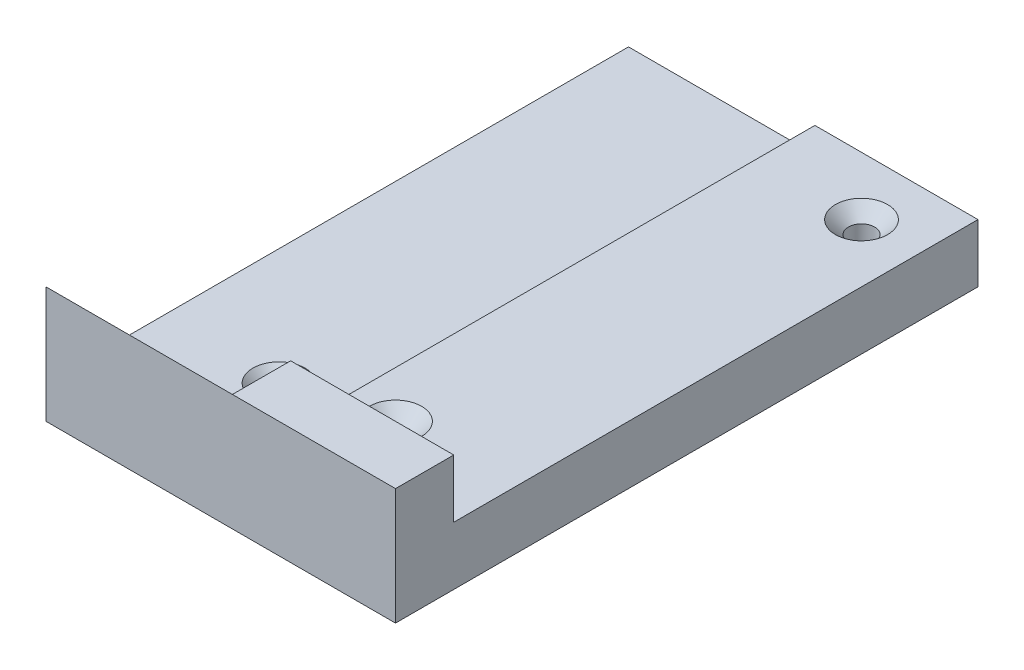
ISO-10303-21;
HEADER;
FILE_DESCRIPTION(('STEP AP214'),'2;1');
FILE_NAME('part.step','',(''),(''),'','','');
FILE_SCHEMA(('AUTOMOTIVE_DESIGN { 1 0 10303 214 1 1 1 1 }'));
ENDSEC;
DATA;
#1=APPLICATION_CONTEXT('core data for automotive mechanical design processes');
#2=APPLICATION_PROTOCOL_DEFINITION('international standard','automotive_design',2000,#1);
#3=PRODUCT_CONTEXT('',#1,'mechanical');
#4=PRODUCT('Part','Part','',(#3));
#5=PRODUCT_RELATED_PRODUCT_CATEGORY('part','',(#4));
#6=PRODUCT_DEFINITION_FORMATION('','',#4);
#7=PRODUCT_DEFINITION_CONTEXT('part definition',#1,'design');
#8=PRODUCT_DEFINITION('design','',#6,#7);
#9=PRODUCT_DEFINITION_SHAPE('','',#8);
#10=(LENGTH_UNIT() NAMED_UNIT(*) SI_UNIT(.MILLI.,.METRE.));
#11=(NAMED_UNIT(*) PLANE_ANGLE_UNIT() SI_UNIT($,.RADIAN.));
#12=(NAMED_UNIT(*) SI_UNIT($,.STERADIAN.) SOLID_ANGLE_UNIT());
#13=UNCERTAINTY_MEASURE_WITH_UNIT(LENGTH_MEASURE(1.E-05),#10,'distance_accuracy_value','');
#14=(GEOMETRIC_REPRESENTATION_CONTEXT(3) GLOBAL_UNCERTAINTY_ASSIGNED_CONTEXT((#13)) GLOBAL_UNIT_ASSIGNED_CONTEXT((#10,
#11,#12)) REPRESENTATION_CONTEXT('',''));
#15=CARTESIAN_POINT('',(0.,0.,0.));
#16=DIRECTION('',(0.,0.,1.));
#17=DIRECTION('',(1.,0.,0.));
#18=AXIS2_PLACEMENT_3D('',#15,#16,#17);
#19=CARTESIAN_POINT('',(-30.,20.,-50.));
#20=DIRECTION('',(1.,0.,0.));
#21=DIRECTION('',(0.,0.,1.));
#22=AXIS2_PLACEMENT_3D('',#19,#20,#21);
#23=PLANE('',#22);
#24=DIRECTION('',(0.,-0.784485752916001,-0.620146840249804));
#25=VECTOR('',#24,1.);
#26=CARTESIAN_POINT('',(-30.,13.675,45.));
#27=LINE('',#26,#25);
#28=CARTESIAN_POINT('',(-30.,20.,50.));
#29=VERTEX_POINT('',#28);
#30=CARTESIAN_POINT('',(-30.,13.675,45.));
#31=VERTEX_POINT('',#30);
#32=EDGE_CURVE('E114',#29,#31,#27,.T.);
#33=ORIENTED_EDGE('',*,*,#32,.T.);
#34=DIRECTION('',(0.,1.,0.));
#35=VECTOR('',#34,1.);
#36=CARTESIAN_POINT('',(-30.,5.675,45.));
#37=LINE('',#36,#35);
#38=CARTESIAN_POINT('',(-30.,5.675,45.));
#39=VERTEX_POINT('',#38);
#40=EDGE_CURVE('E123',#39,#31,#37,.T.);
#41=ORIENTED_EDGE('',*,*,#40,.F.);
#42=DIRECTION('',(0.,0.,-1.));
#43=VECTOR('',#42,1.);
#44=CARTESIAN_POINT('',(-30.,5.675,-50.));
#45=LINE('',#44,#43);
#46=CARTESIAN_POINT('',(-30.,5.675,-50.));
#47=VERTEX_POINT('',#46);
#48=EDGE_CURVE('E152',#39,#47,#45,.T.);
#49=ORIENTED_EDGE('',*,*,#48,.T.);
#50=DIRECTION('',(0.,-1.,0.));
#51=VECTOR('',#50,1.);
#52=CARTESIAN_POINT('',(-30.,20.,-50.));
#53=LINE('',#52,#51);
#54=CARTESIAN_POINT('',(-30.,0.,-50.));
#55=VERTEX_POINT('',#54);
#56=EDGE_CURVE('E184',#47,#55,#53,.T.);
#57=ORIENTED_EDGE('',*,*,#56,.T.);
#58=DIRECTION('',(0.,0.,-1.));
#59=VECTOR('',#58,1.);
#60=CARTESIAN_POINT('',(-30.,0.,-50.));
#61=LINE('',#60,#59);
#62=CARTESIAN_POINT('',(-30.,0.,50.));
#63=VERTEX_POINT('',#62);
#64=EDGE_CURVE('E177',#63,#55,#61,.T.);
#65=ORIENTED_EDGE('',*,*,#64,.F.);
#66=DIRECTION('',(0.,-1.,0.));
#67=VECTOR('',#66,1.);
#68=CARTESIAN_POINT('',(-30.,20.,50.));
#69=LINE('',#68,#67);
#70=EDGE_CURVE('E45',#29,#63,#69,.T.);
#71=ORIENTED_EDGE('',*,*,#70,.F.);
#72=EDGE_LOOP('',(#33,#41,#49,#57,#65,#71));
#73=FACE_BOUND('',#72,.T.);
#74=ADVANCED_FACE('F37',(#73),#23,.F.);
#75=CARTESIAN_POINT('',(-30.,5.675,45.));
#76=DIRECTION('',(0.,0.,1.));
#77=DIRECTION('',(-1.,0.,0.));
#78=AXIS2_PLACEMENT_3D('',#75,#76,#77);
#79=PLANE('',#78);
#80=DIRECTION('',(1.,0.,0.));
#81=VECTOR('',#80,1.);
#82=CARTESIAN_POINT('',(-217.90199457749,13.675,45.));
#83=LINE('',#82,#81);
#84=CARTESIAN_POINT('',(2.,13.675,45.));
#85=VERTEX_POINT('',#84);
#86=EDGE_CURVE('E52',#31,#85,#83,.T.);
#87=ORIENTED_EDGE('',*,*,#86,.T.);
#88=DIRECTION('',(0.,1.,0.));
#89=VECTOR('',#88,1.);
#90=CARTESIAN_POINT('',(2.00000000000002,5.675,45.));
#91=LINE('',#90,#89);
#92=CARTESIAN_POINT('',(2.00000000000002,5.675,45.));
#93=VERTEX_POINT('',#92);
#94=EDGE_CURVE('E117',#93,#85,#91,.T.);
#95=ORIENTED_EDGE('',*,*,#94,.F.);
#96=DIRECTION('',(-1.,0.,0.));
#97=VECTOR('',#96,1.);
#98=CARTESIAN_POINT('',(-30.,5.675,45.));
#99=LINE('',#98,#97);
#100=EDGE_CURVE('E159',#93,#39,#99,.T.);
#101=ORIENTED_EDGE('',*,*,#100,.T.);
#102=ORIENTED_EDGE('',*,*,#40,.T.);
#103=EDGE_LOOP('',(#87,#95,#101,#102));
#104=FACE_BOUND('',#103,.T.);
#105=ADVANCED_FACE('F126',(#104),#79,.F.);
#106=CARTESIAN_POINT('',(-30.,20.,-50.));
#107=DIRECTION('',(0.,0.,1.));
#108=DIRECTION('',(-1.,0.,0.));
#109=AXIS2_PLACEMENT_3D('',#106,#107,#108);
#110=PLANE('',#109);
#111=DIRECTION('',(1.,0.,0.));
#112=VECTOR('',#111,1.);
#113=CARTESIAN_POINT('',(2.00000000000003,10.,-50.));
#114=LINE('',#113,#112);
#115=CARTESIAN_POINT('',(2.00000000000003,10.,-50.));
#116=VERTEX_POINT('',#115);
#117=CARTESIAN_POINT('',(30.,10.,-50.));
#118=VERTEX_POINT('',#117);
#119=EDGE_CURVE('E138',#116,#118,#114,.T.);
#120=ORIENTED_EDGE('',*,*,#119,.T.);
#121=DIRECTION('',(0.,-1.,0.));
#122=VECTOR('',#121,1.);
#123=CARTESIAN_POINT('',(30.,20.,-50.));
#124=LINE('',#123,#122);
#125=CARTESIAN_POINT('',(30.,0.,-50.));
#126=VERTEX_POINT('',#125);
#127=EDGE_CURVE('E172',#118,#126,#124,.T.);
#128=ORIENTED_EDGE('',*,*,#127,.T.);
#129=DIRECTION('',(1.,0.,0.));
#130=VECTOR('',#129,1.);
#131=CARTESIAN_POINT('',(-30.,0.,-50.));
#132=LINE('',#131,#130);
#133=EDGE_CURVE('E170',#55,#126,#132,.T.);
#134=ORIENTED_EDGE('',*,*,#133,.F.);
#135=ORIENTED_EDGE('',*,*,#56,.F.);
#136=DIRECTION('',(1.,0.,0.));
#137=VECTOR('',#136,1.);
#138=CARTESIAN_POINT('',(-30.,5.675,-50.));
#139=LINE('',#138,#137);
#140=CARTESIAN_POINT('',(2.00000000000002,5.675,-50.));
#141=VERTEX_POINT('',#140);
#142=EDGE_CURVE('E155',#47,#141,#139,.T.);
#143=ORIENTED_EDGE('',*,*,#142,.T.);
#144=DIRECTION('',(0.,1.,0.));
#145=VECTOR('',#144,1.);
#146=CARTESIAN_POINT('',(2.00000000000002,5.675,-50.));
#147=LINE('',#146,#145);
#148=EDGE_CURVE('E124',#141,#116,#147,.T.);
#149=ORIENTED_EDGE('',*,*,#148,.T.);
#150=EDGE_LOOP('',(#120,#128,#134,#135,#143,#149));
#151=FACE_BOUND('',#150,.T.);
#152=ADVANCED_FACE('F209',(#151),#110,.F.);
#153=CARTESIAN_POINT('',(30.,20.,-50.));
#154=DIRECTION('',(-1.,0.,0.));
#155=DIRECTION('',(0.,0.,-1.));
#156=AXIS2_PLACEMENT_3D('',#153,#154,#155);
#157=PLANE('',#156);
#158=DIRECTION('',(0.,0.,1.));
#159=VECTOR('',#158,1.);
#160=CARTESIAN_POINT('',(30.,20.,-50.));
#161=LINE('',#160,#159);
#162=CARTESIAN_POINT('',(30.,20.,40.));
#163=VERTEX_POINT('',#162);
#164=CARTESIAN_POINT('',(30.,20.,50.));
#165=VERTEX_POINT('',#164);
#166=EDGE_CURVE('E166',#163,#165,#161,.T.);
#167=ORIENTED_EDGE('',*,*,#166,.T.);
#168=DIRECTION('',(0.,-1.,0.));
#169=VECTOR('',#168,1.);
#170=CARTESIAN_POINT('',(30.,20.,50.));
#171=LINE('',#170,#169);
#172=CARTESIAN_POINT('',(30.,0.,50.));
#173=VERTEX_POINT('',#172);
#174=EDGE_CURVE('E11',#165,#173,#171,.T.);
#175=ORIENTED_EDGE('',*,*,#174,.T.);
#176=DIRECTION('',(0.,0.,1.));
#177=VECTOR('',#176,1.);
#178=CARTESIAN_POINT('',(30.,0.,-50.));
#179=LINE('',#178,#177);
#180=EDGE_CURVE('E162',#126,#173,#179,.T.);
#181=ORIENTED_EDGE('',*,*,#180,.F.);
#182=ORIENTED_EDGE('',*,*,#127,.F.);
#183=DIRECTION('',(0.,0.,1.));
#184=VECTOR('',#183,1.);
#185=CARTESIAN_POINT('',(30.,10.,40.));
#186=LINE('',#185,#184);
#187=CARTESIAN_POINT('',(30.,10.,40.));
#188=VERTEX_POINT('',#187);
#189=EDGE_CURVE('E141',#118,#188,#186,.T.);
#190=ORIENTED_EDGE('',*,*,#189,.T.);
#191=DIRECTION('',(0.,1.,0.));
#192=VECTOR('',#191,1.);
#193=CARTESIAN_POINT('',(30.,10.,40.));
#194=LINE('',#193,#192);
#195=EDGE_CURVE('E145',#188,#163,#194,.T.);
#196=ORIENTED_EDGE('',*,*,#195,.T.);
#197=EDGE_LOOP('',(#167,#175,#181,#182,#190,#196));
#198=FACE_BOUND('',#197,.T.);
#199=ADVANCED_FACE('F39',(#198),#157,.F.);
#200=CARTESIAN_POINT('',(-30.,20.,50.));
#201=DIRECTION('',(0.,0.,-1.));
#202=DIRECTION('',(1.,0.,0.));
#203=AXIS2_PLACEMENT_3D('',#200,#201,#202);
#204=PLANE('',#203);
#205=DIRECTION('',(-1.,0.,0.));
#206=VECTOR('',#205,1.);
#207=CARTESIAN_POINT('',(-30.,0.,50.));
#208=LINE('',#207,#206);
#209=EDGE_CURVE('E175',#173,#63,#208,.T.);
#210=ORIENTED_EDGE('',*,*,#209,.F.);
#211=ORIENTED_EDGE('',*,*,#174,.F.);
#212=DIRECTION('',(-1.,0.,0.));
#213=VECTOR('',#212,1.);
#214=CARTESIAN_POINT('',(-30.,20.,50.));
#215=LINE('',#214,#213);
#216=CARTESIAN_POINT('',(2.00000000000002,20.,50.));
#217=VERTEX_POINT('',#216);
#218=EDGE_CURVE('E169',#165,#217,#215,.T.);
#219=ORIENTED_EDGE('',*,*,#218,.T.);
#220=DIRECTION('',(1.,0.,0.));
#221=VECTOR('',#220,1.);
#222=CARTESIAN_POINT('',(-217.90199457749,20.,50.));
#223=LINE('',#222,#221);
#224=EDGE_CURVE('E112',#29,#217,#223,.T.);
#225=ORIENTED_EDGE('',*,*,#224,.F.);
#226=ORIENTED_EDGE('',*,*,#70,.T.);
#227=EDGE_LOOP('',(#210,#211,#219,#225,#226));
#228=FACE_BOUND('',#227,.T.);
#229=ADVANCED_FACE('F190',(#228),#204,.F.);
#230=CARTESIAN_POINT('',(0.,20.,0.));
#231=DIRECTION('',(0.,-1.,0.));
#232=DIRECTION('',(0.,0.,1.));
#233=AXIS2_PLACEMENT_3D('',#230,#231,#232);
#234=PLANE('',#233);
#235=ORIENTED_EDGE('',*,*,#218,.F.);
#236=ORIENTED_EDGE('',*,*,#166,.F.);
#237=DIRECTION('',(-1.,0.,0.));
#238=VECTOR('',#237,1.);
#239=CARTESIAN_POINT('',(2.00000000000002,20.,40.));
#240=LINE('',#239,#238);
#241=CARTESIAN_POINT('',(2.00000000000002,20.,40.));
#242=VERTEX_POINT('',#241);
#243=EDGE_CURVE('E129',#163,#242,#240,.T.);
#244=ORIENTED_EDGE('',*,*,#243,.T.);
#245=DIRECTION('',(0.,0.,1.));
#246=VECTOR('',#245,1.);
#247=CARTESIAN_POINT('',(2.00000000000002,20.,-50.));
#248=LINE('',#247,#246);
#249=EDGE_CURVE('E149',#242,#217,#248,.T.);
#250=ORIENTED_EDGE('',*,*,#249,.T.);
#251=EDGE_LOOP('',(#235,#236,#244,#250));
#252=FACE_BOUND('',#251,.T.);
#253=ADVANCED_FACE('F200',(#252),#234,.F.);
#254=CARTESIAN_POINT('',(0.,0.,0.));
#255=DIRECTION('',(0.,-1.,0.));
#256=DIRECTION('',(0.,0.,1.));
#257=AXIS2_PLACEMENT_3D('',#254,#255,#256);
#258=PLANE('',#257);
#259=CARTESIAN_POINT('',(10.,0.,30.));
#260=DIRECTION('',(0.,-1.,0.));
#261=DIRECTION('',(0.,0.,-1.));
#262=AXIS2_PLACEMENT_3D('',#259,#260,#261);
#263=CIRCLE('',#262,2.25);
#264=CARTESIAN_POINT('',(10.,0.,27.75));
#265=VERTEX_POINT('',#264);
#266=EDGE_CURVE('E226',#265,#265,#263,.T.);
#267=ORIENTED_EDGE('',*,*,#266,.F.);
#268=EDGE_LOOP('',(#267));
#269=FACE_BOUND('',#268,.T.);
#270=CARTESIAN_POINT('',(-9.99999999999998,0.,30.));
#271=DIRECTION('',(0.,-1.,0.));
#272=DIRECTION('',(0.,0.,-1.));
#273=AXIS2_PLACEMENT_3D('',#270,#271,#272);
#274=CIRCLE('',#273,2.25);
#275=CARTESIAN_POINT('',(-9.99999999999998,0.,27.75));
#276=VERTEX_POINT('',#275);
#277=EDGE_CURVE('E223',#276,#276,#274,.T.);
#278=ORIENTED_EDGE('',*,*,#277,.F.);
#279=EDGE_LOOP('',(#278));
#280=FACE_BOUND('',#279,.T.);
#281=CARTESIAN_POINT('',(20.,0.,-40.));
#282=DIRECTION('',(0.,-1.,0.));
#283=DIRECTION('',(0.,0.,-1.));
#284=AXIS2_PLACEMENT_3D('',#281,#282,#283);
#285=CIRCLE('',#284,2.25);
#286=CARTESIAN_POINT('',(20.,0.,-42.25));
#287=VERTEX_POINT('',#286);
#288=EDGE_CURVE('E213',#287,#287,#285,.T.);
#289=ORIENTED_EDGE('',*,*,#288,.F.);
#290=EDGE_LOOP('',(#289));
#291=FACE_BOUND('',#290,.T.);
#292=ORIENTED_EDGE('',*,*,#180,.T.);
#293=ORIENTED_EDGE('',*,*,#209,.T.);
#294=ORIENTED_EDGE('',*,*,#64,.T.);
#295=ORIENTED_EDGE('',*,*,#133,.T.);
#296=EDGE_LOOP('',(#292,#293,#294,#295));
#297=FACE_BOUND('',#296,.T.);
#298=ADVANCED_FACE('F195',(#269,#280,#291,#297),#258,.T.);
#299=CARTESIAN_POINT('',(2.00000000000002,5.675,-50.));
#300=DIRECTION('',(1.,0.,0.));
#301=DIRECTION('',(0.,0.,1.));
#302=AXIS2_PLACEMENT_3D('',#299,#300,#301);
#303=PLANE('',#302);
#304=DIRECTION('',(0.,0.,-1.));
#305=VECTOR('',#304,1.);
#306=CARTESIAN_POINT('',(2.00000000000002,10.,40.));
#307=LINE('',#306,#305);
#308=CARTESIAN_POINT('',(2.00000000000002,10.,40.));
#309=VERTEX_POINT('',#308);
#310=EDGE_CURVE('E132',#309,#116,#307,.T.);
#311=ORIENTED_EDGE('',*,*,#310,.T.);
#312=ORIENTED_EDGE('',*,*,#148,.F.);
#313=DIRECTION('',(0.,0.,1.));
#314=VECTOR('',#313,1.);
#315=CARTESIAN_POINT('',(2.00000000000002,5.675,-50.));
#316=LINE('',#315,#314);
#317=EDGE_CURVE('E120',#141,#93,#316,.T.);
#318=ORIENTED_EDGE('',*,*,#317,.T.);
#319=ORIENTED_EDGE('',*,*,#94,.T.);
#320=DIRECTION('',(0.,-0.784485752916001,-0.620146840249804));
#321=VECTOR('',#320,1.);
#322=CARTESIAN_POINT('',(2.00000000000003,13.675,45.));
#323=LINE('',#322,#321);
#324=EDGE_CURVE('E59',#217,#85,#323,.T.);
#325=ORIENTED_EDGE('',*,*,#324,.F.);
#326=ORIENTED_EDGE('',*,*,#249,.F.);
#327=DIRECTION('',(0.,1.,0.));
#328=VECTOR('',#327,1.);
#329=CARTESIAN_POINT('',(2.00000000000002,10.,40.));
#330=LINE('',#329,#328);
#331=EDGE_CURVE('E147',#309,#242,#330,.T.);
#332=ORIENTED_EDGE('',*,*,#331,.F.);
#333=EDGE_LOOP('',(#311,#312,#318,#319,#325,#326,#332));
#334=FACE_BOUND('',#333,.T.);
#335=ADVANCED_FACE('F118',(#334),#303,.F.);
#336=CARTESIAN_POINT('',(0.,5.675,0.));
#337=DIRECTION('',(0.,-1.,0.));
#338=DIRECTION('',(0.,0.,1.));
#339=AXIS2_PLACEMENT_3D('',#336,#337,#338);
#340=PLANE('',#339);
#341=CARTESIAN_POINT('',(-9.99999999999998,5.675,30.));
#342=DIRECTION('',(0.,-1.,0.));
#343=DIRECTION('',(0.,0.,-1.));
#344=AXIS2_PLACEMENT_3D('',#341,#342,#343);
#345=CIRCLE('',#344,4.48);
#346=CARTESIAN_POINT('',(-9.99999999999998,5.675,25.52));
#347=VERTEX_POINT('',#346);
#348=EDGE_CURVE('E238',#347,#347,#345,.T.);
#349=ORIENTED_EDGE('',*,*,#348,.T.);
#350=EDGE_LOOP('',(#349));
#351=FACE_BOUND('',#350,.T.);
#352=ORIENTED_EDGE('',*,*,#48,.F.);
#353=ORIENTED_EDGE('',*,*,#100,.F.);
#354=ORIENTED_EDGE('',*,*,#317,.F.);
#355=ORIENTED_EDGE('',*,*,#142,.F.);
#356=EDGE_LOOP('',(#352,#353,#354,#355));
#357=FACE_BOUND('',#356,.T.);
#358=ADVANCED_FACE('F212',(#351,#357),#340,.F.);
#359=CARTESIAN_POINT('',(2.00000000000002,10.,40.));
#360=DIRECTION('',(0.,0.,1.));
#361=DIRECTION('',(-1.,0.,0.));
#362=AXIS2_PLACEMENT_3D('',#359,#360,#361);
#363=PLANE('',#362);
#364=ORIENTED_EDGE('',*,*,#243,.F.);
#365=ORIENTED_EDGE('',*,*,#195,.F.);
#366=DIRECTION('',(-1.,0.,0.));
#367=VECTOR('',#366,1.);
#368=CARTESIAN_POINT('',(2.00000000000002,10.,40.));
#369=LINE('',#368,#367);
#370=EDGE_CURVE('E144',#188,#309,#369,.T.);
#371=ORIENTED_EDGE('',*,*,#370,.T.);
#372=ORIENTED_EDGE('',*,*,#331,.T.);
#373=EDGE_LOOP('',(#364,#365,#371,#372));
#374=FACE_BOUND('',#373,.T.);
#375=ADVANCED_FACE('F323',(#374),#363,.F.);
#376=CARTESIAN_POINT('',(0.,10.,0.));
#377=DIRECTION('',(0.,1.,0.));
#378=DIRECTION('',(0.,0.,-1.));
#379=AXIS2_PLACEMENT_3D('',#376,#377,#378);
#380=PLANE('',#379);
#381=CARTESIAN_POINT('',(10.,10.,30.));
#382=DIRECTION('',(0.,-1.,0.));
#383=DIRECTION('',(0.,0.,-1.));
#384=AXIS2_PLACEMENT_3D('',#381,#382,#383);
#385=CIRCLE('',#384,4.48);
#386=CARTESIAN_POINT('',(10.,10.,25.52));
#387=VERTEX_POINT('',#386);
#388=EDGE_CURVE('E232',#387,#387,#385,.T.);
#389=ORIENTED_EDGE('',*,*,#388,.T.);
#390=EDGE_LOOP('',(#389));
#391=FACE_BOUND('',#390,.T.);
#392=CARTESIAN_POINT('',(20.,10.,-40.));
#393=DIRECTION('',(0.,-1.,0.));
#394=DIRECTION('',(0.,0.,-1.));
#395=AXIS2_PLACEMENT_3D('',#392,#393,#394);
#396=CIRCLE('',#395,4.48);
#397=CARTESIAN_POINT('',(20.,10.,-44.48));
#398=VERTEX_POINT('',#397);
#399=EDGE_CURVE('E220',#398,#398,#396,.T.);
#400=ORIENTED_EDGE('',*,*,#399,.T.);
#401=EDGE_LOOP('',(#400));
#402=FACE_BOUND('',#401,.T.);
#403=ORIENTED_EDGE('',*,*,#310,.F.);
#404=ORIENTED_EDGE('',*,*,#370,.F.);
#405=ORIENTED_EDGE('',*,*,#189,.F.);
#406=ORIENTED_EDGE('',*,*,#119,.F.);
#407=EDGE_LOOP('',(#403,#404,#405,#406));
#408=FACE_BOUND('',#407,.T.);
#409=ADVANCED_FACE('F206',(#391,#402,#408),#380,.T.);
#410=CARTESIAN_POINT('',(-217.90199457749,13.675,45.));
#411=DIRECTION('',(0.,-0.620146840249803,0.784485752916001));
#412=DIRECTION('',(0.,0.784485752916001,0.620146840249804));
#413=AXIS2_PLACEMENT_3D('',#410,#411,#412);
#414=PLANE('',#413);
#415=ORIENTED_EDGE('',*,*,#32,.F.);
#416=ORIENTED_EDGE('',*,*,#224,.T.);
#417=ORIENTED_EDGE('',*,*,#324,.T.);
#418=ORIENTED_EDGE('',*,*,#86,.F.);
#419=EDGE_LOOP('',(#415,#416,#417,#418));
#420=FACE_BOUND('',#419,.T.);
#421=ADVANCED_FACE('F111',(#420),#414,.F.);
#422=CARTESIAN_POINT('',(20.,10.,-40.));
#423=DIRECTION('',(0.,1.,0.));
#424=DIRECTION('',(0.,0.,-1.));
#425=AXIS2_PLACEMENT_3D('',#422,#423,#424);
#426=CYLINDRICAL_SURFACE('',#425,2.25);
#427=ORIENTED_EDGE('',*,*,#288,.T.);
#428=EDGE_LOOP('',(#427));
#429=FACE_BOUND('',#428,.T.);
#430=CARTESIAN_POINT('',(20.,7.77,-40.));
#431=DIRECTION('',(0.,-1.,0.));
#432=DIRECTION('',(0.,0.,-1.));
#433=AXIS2_PLACEMENT_3D('',#430,#431,#432);
#434=CIRCLE('',#433,2.25);
#435=CARTESIAN_POINT('',(20.,7.77,-42.25));
#436=VERTEX_POINT('',#435);
#437=EDGE_CURVE('E215',#436,#436,#434,.T.);
#438=ORIENTED_EDGE('',*,*,#437,.F.);
#439=EDGE_LOOP('',(#438));
#440=FACE_BOUND('',#439,.T.);
#441=ADVANCED_FACE('F346',(#429,#440),#426,.F.);
#442=CARTESIAN_POINT('',(20.,10.,-40.));
#443=DIRECTION('',(0.,1.,0.));
#444=DIRECTION('',(0.,0.,-1.));
#445=AXIS2_PLACEMENT_3D('',#442,#443,#444);
#446=CONICAL_SURFACE('',#445,4.48,0.785398163397449);
#447=ORIENTED_EDGE('',*,*,#437,.T.);
#448=EDGE_LOOP('',(#447));
#449=FACE_BOUND('',#448,.T.);
#450=ORIENTED_EDGE('',*,*,#399,.F.);
#451=EDGE_LOOP('',(#450));
#452=FACE_BOUND('',#451,.T.);
#453=ADVANCED_FACE('F354',(#449,#452),#446,.F.);
#454=CARTESIAN_POINT('',(-9.99999999999998,10.,30.));
#455=DIRECTION('',(0.,1.,0.));
#456=DIRECTION('',(0.,0.,-1.));
#457=AXIS2_PLACEMENT_3D('',#454,#455,#456);
#458=CYLINDRICAL_SURFACE('',#457,2.25);
#459=CARTESIAN_POINT('',(-9.99999999999998,3.44499999999999,30.));
#460=DIRECTION('',(0.,-1.,0.));
#461=DIRECTION('',(0.,0.,-1.));
#462=AXIS2_PLACEMENT_3D('',#459,#460,#461);
#463=CIRCLE('',#462,2.24999999999999);
#464=CARTESIAN_POINT('',(-9.99999999999998,3.44499999999999,27.75));
#465=VERTEX_POINT('',#464);
#466=EDGE_CURVE('E235',#465,#465,#463,.T.);
#467=ORIENTED_EDGE('',*,*,#466,.F.);
#468=EDGE_LOOP('',(#467));
#469=FACE_BOUND('',#468,.T.);
#470=ORIENTED_EDGE('',*,*,#277,.T.);
#471=EDGE_LOOP('',(#470));
#472=FACE_BOUND('',#471,.T.);
#473=ADVANCED_FACE('F363',(#469,#472),#458,.F.);
#474=CARTESIAN_POINT('',(10.,10.,30.));
#475=DIRECTION('',(0.,1.,0.));
#476=DIRECTION('',(0.,0.,-1.));
#477=AXIS2_PLACEMENT_3D('',#474,#475,#476);
#478=CYLINDRICAL_SURFACE('',#477,2.25);
#479=ORIENTED_EDGE('',*,*,#266,.T.);
#480=EDGE_LOOP('',(#479));
#481=FACE_BOUND('',#480,.T.);
#482=CARTESIAN_POINT('',(10.,7.77,30.));
#483=DIRECTION('',(0.,-1.,0.));
#484=DIRECTION('',(0.,0.,-1.));
#485=AXIS2_PLACEMENT_3D('',#482,#483,#484);
#486=CIRCLE('',#485,2.25);
#487=CARTESIAN_POINT('',(10.,7.77,27.75));
#488=VERTEX_POINT('',#487);
#489=EDGE_CURVE('E229',#488,#488,#486,.T.);
#490=ORIENTED_EDGE('',*,*,#489,.F.);
#491=EDGE_LOOP('',(#490));
#492=FACE_BOUND('',#491,.T.);
#493=ADVANCED_FACE('F251',(#481,#492),#478,.F.);
#494=CARTESIAN_POINT('',(10.,10.,30.));
#495=DIRECTION('',(0.,1.,0.));
#496=DIRECTION('',(0.,0.,-1.));
#497=AXIS2_PLACEMENT_3D('',#494,#495,#496);
#498=CONICAL_SURFACE('',#497,4.48,0.785398163397448);
#499=ORIENTED_EDGE('',*,*,#489,.T.);
#500=EDGE_LOOP('',(#499));
#501=FACE_BOUND('',#500,.T.);
#502=ORIENTED_EDGE('',*,*,#388,.F.);
#503=EDGE_LOOP('',(#502));
#504=FACE_BOUND('',#503,.T.);
#505=ADVANCED_FACE('F245',(#501,#504),#498,.F.);
#506=CARTESIAN_POINT('',(-9.99999999999998,5.675,30.));
#507=DIRECTION('',(0.,1.,0.));
#508=DIRECTION('',(0.,0.,-1.));
#509=AXIS2_PLACEMENT_3D('',#506,#507,#508);
#510=CONICAL_SURFACE('',#509,4.48,0.785398163397449);
#511=ORIENTED_EDGE('',*,*,#466,.T.);
#512=EDGE_LOOP('',(#511));
#513=FACE_BOUND('',#512,.T.);
#514=ORIENTED_EDGE('',*,*,#348,.F.);
#515=EDGE_LOOP('',(#514));
#516=FACE_BOUND('',#515,.T.);
#517=ADVANCED_FACE('F243',(#513,#516),#510,.F.);
#518=CLOSED_SHELL('',(#74,#105,#152,#199,#229,#253,#298,#335,#358,#375,#409,#421,#441,#453,#473,
#493,#505,#517));
#519=MANIFOLD_SOLID_BREP('B2',#518);
#520=ADVANCED_BREP_SHAPE_REPRESENTATION('',(#18,#519),#14);
#521=SHAPE_DEFINITION_REPRESENTATION(#9,#520);
ENDSEC;
END-ISO-10303-21;
